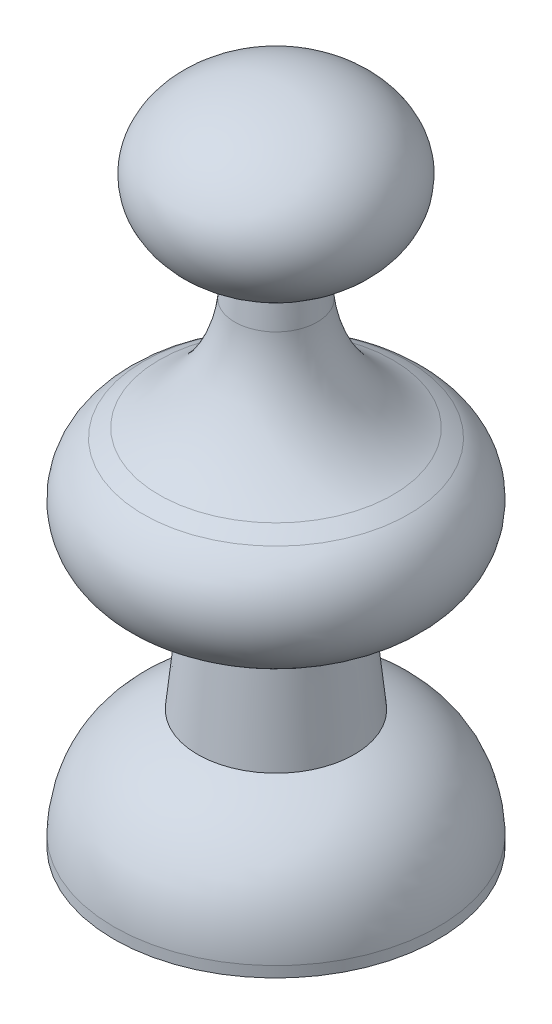
ISO-10303-21;
HEADER;
FILE_DESCRIPTION(('STEP AP214'),'2;1');
FILE_NAME('part.step','',(''),(''),'','','');
FILE_SCHEMA(('AUTOMOTIVE_DESIGN { 1 0 10303 214 1 1 1 1 }'));
ENDSEC;
DATA;
#1=APPLICATION_CONTEXT('core data for automotive mechanical design processes');
#2=APPLICATION_PROTOCOL_DEFINITION('international standard','automotive_design',2000,#1);
#3=PRODUCT_CONTEXT('',#1,'mechanical');
#4=PRODUCT('Part','Part','',(#3));
#5=PRODUCT_RELATED_PRODUCT_CATEGORY('part','',(#4));
#6=PRODUCT_DEFINITION_FORMATION('','',#4);
#7=PRODUCT_DEFINITION_CONTEXT('part definition',#1,'design');
#8=PRODUCT_DEFINITION('design','',#6,#7);
#9=PRODUCT_DEFINITION_SHAPE('','',#8);
#10=(LENGTH_UNIT() NAMED_UNIT(*) SI_UNIT(.MILLI.,.METRE.));
#11=(NAMED_UNIT(*) PLANE_ANGLE_UNIT() SI_UNIT($,.RADIAN.));
#12=(NAMED_UNIT(*) SI_UNIT($,.STERADIAN.) SOLID_ANGLE_UNIT());
#13=UNCERTAINTY_MEASURE_WITH_UNIT(LENGTH_MEASURE(1.E-05),#10,'distance_accuracy_value','');
#14=(GEOMETRIC_REPRESENTATION_CONTEXT(3) GLOBAL_UNCERTAINTY_ASSIGNED_CONTEXT((#13)) GLOBAL_UNIT_ASSIGNED_CONTEXT((#10,
#11,#12)) REPRESENTATION_CONTEXT('',''));
#15=CARTESIAN_POINT('',(0.,0.,0.));
#16=DIRECTION('',(0.,0.,1.));
#17=DIRECTION('',(1.,0.,0.));
#18=AXIS2_PLACEMENT_3D('',#15,#16,#17);
#19=CARTESIAN_POINT('',(0.,-0.762,0.));
#20=DIRECTION('',(0.,1.,0.));
#21=DIRECTION('',(0.,0.,1.));
#22=AXIS2_PLACEMENT_3D('',#19,#20,#21);
#23=CYLINDRICAL_SURFACE('',#22,11.5);
#24=CARTESIAN_POINT('',(0.,-0.762,0.));
#25=DIRECTION('',(0.,-1.,0.));
#26=DIRECTION('',(0.,0.,-1.));
#27=AXIS2_PLACEMENT_3D('',#24,#25,#26);
#28=CIRCLE('',#27,11.5);
#29=CARTESIAN_POINT('',(0.,-0.762,11.5));
#30=VERTEX_POINT('',#29);
#31=EDGE_CURVE('E11',#30,#30,#28,.T.);
#32=CARTESIAN_POINT('',(0.,0.,0.));
#33=DIRECTION('',(0.,-1.,0.));
#34=DIRECTION('',(0.,0.,-1.));
#35=AXIS2_PLACEMENT_3D('',#32,#33,#34);
#36=CIRCLE('',#35,11.5);
#37=CARTESIAN_POINT('',(0.,0.,11.5));
#38=VERTEX_POINT('',#37);
#39=EDGE_CURVE('E45',#38,#38,#36,.T.);
#40=CARTESIAN_POINT('',(0.,-0.762,11.5));
#41=CARTESIAN_POINT('',(0.,-0.7540625,11.5));
#42=CARTESIAN_POINT('',(0.,-0.746125,11.5));
#43=CARTESIAN_POINT('',(0.,-0.73025,11.5));
#44=CARTESIAN_POINT('',(0.,-0.7223125,11.5));
#45=CARTESIAN_POINT('',(0.,-0.7064375,11.5));
#46=CARTESIAN_POINT('',(0.,-0.6985,11.5));
#47=CARTESIAN_POINT('',(0.,-0.682625,11.5));
#48=CARTESIAN_POINT('',(0.,-0.6746875,11.5));
#49=CARTESIAN_POINT('',(0.,-0.6588125,11.5));
#50=CARTESIAN_POINT('',(0.,-0.650875,11.5));
#51=CARTESIAN_POINT('',(0.,-0.635,11.5));
#52=CARTESIAN_POINT('',(0.,-0.6270625,11.5));
#53=CARTESIAN_POINT('',(0.,-0.6111875,11.5));
#54=CARTESIAN_POINT('',(0.,-0.60325,11.5));
#55=CARTESIAN_POINT('',(0.,-0.587375,11.5));
#56=CARTESIAN_POINT('',(0.,-0.5794375,11.5));
#57=CARTESIAN_POINT('',(0.,-0.5635625,11.5));
#58=CARTESIAN_POINT('',(0.,-0.555625,11.5));
#59=CARTESIAN_POINT('',(0.,-0.53975,11.5));
#60=CARTESIAN_POINT('',(0.,-0.5318125,11.5));
#61=CARTESIAN_POINT('',(0.,-0.5159375,11.5));
#62=CARTESIAN_POINT('',(0.,-0.508,11.5));
#63=CARTESIAN_POINT('',(0.,-0.492125,11.5));
#64=CARTESIAN_POINT('',(0.,-0.4841875,11.5));
#65=CARTESIAN_POINT('',(0.,-0.4683125,11.5));
#66=CARTESIAN_POINT('',(0.,-0.460375,11.5));
#67=CARTESIAN_POINT('',(0.,-0.4445,11.5));
#68=CARTESIAN_POINT('',(0.,-0.4365625,11.5));
#69=CARTESIAN_POINT('',(0.,-0.4206875,11.5));
#70=CARTESIAN_POINT('',(0.,-0.41275,11.5));
#71=CARTESIAN_POINT('',(0.,-0.396875,11.5));
#72=CARTESIAN_POINT('',(0.,-0.3889375,11.5));
#73=CARTESIAN_POINT('',(0.,-0.3730625,11.5));
#74=CARTESIAN_POINT('',(0.,-0.365125,11.5));
#75=CARTESIAN_POINT('',(0.,-0.34925,11.5));
#76=CARTESIAN_POINT('',(0.,-0.3413125,11.5));
#77=CARTESIAN_POINT('',(0.,-0.3254375,11.5));
#78=CARTESIAN_POINT('',(0.,-0.3175,11.5));
#79=CARTESIAN_POINT('',(0.,-0.301625,11.5));
#80=CARTESIAN_POINT('',(0.,-0.2936875,11.5));
#81=CARTESIAN_POINT('',(0.,-0.2778125,11.5));
#82=CARTESIAN_POINT('',(0.,-0.269875,11.5));
#83=CARTESIAN_POINT('',(0.,-0.254,11.5));
#84=CARTESIAN_POINT('',(0.,-0.2460625,11.5));
#85=CARTESIAN_POINT('',(0.,-0.2301875,11.5));
#86=CARTESIAN_POINT('',(0.,-0.22225,11.5));
#87=CARTESIAN_POINT('',(0.,-0.206375,11.5));
#88=CARTESIAN_POINT('',(0.,-0.1984375,11.5));
#89=CARTESIAN_POINT('',(0.,-0.1825625,11.5));
#90=CARTESIAN_POINT('',(0.,-0.174625,11.5));
#91=CARTESIAN_POINT('',(0.,-0.15875,11.5));
#92=CARTESIAN_POINT('',(0.,-0.1508125,11.5));
#93=CARTESIAN_POINT('',(0.,-0.1349375,11.5));
#94=CARTESIAN_POINT('',(0.,-0.127,11.5));
#95=CARTESIAN_POINT('',(0.,-0.111125,11.5));
#96=CARTESIAN_POINT('',(0.,-0.1031875,11.5));
#97=CARTESIAN_POINT('',(0.,-0.0873125,11.5));
#98=CARTESIAN_POINT('',(0.,-0.079375,11.5));
#99=CARTESIAN_POINT('',(0.,-0.0635,11.5));
#100=CARTESIAN_POINT('',(0.,-0.0555625,11.5));
#101=CARTESIAN_POINT('',(0.,-0.0396875,11.5));
#102=CARTESIAN_POINT('',(0.,-0.03175,11.5));
#103=CARTESIAN_POINT('',(0.,-0.015875,11.5));
#104=CARTESIAN_POINT('',(0.,-0.00793749999999999,11.5));
#105=CARTESIAN_POINT('',(0.,0.,11.5));
#106=B_SPLINE_CURVE_WITH_KNOTS('',3,(#40,#41,#42,#43,#44,#45,#46,#47,#48,#49,#50,#51,#52,#53,
#54,#55,#56,#57,#58,#59,#60,#61,#62,#63,#64,#65,#66,#67,#68,#69,#70,#71,#72,#73,#74,#75,#76,#77,
#78,#79,#80,#81,#82,#83,#84,#85,#86,#87,#88,#89,#90,#91,#92,#93,#94,#95,#96,#97,#98,#99,#100,
#101,#102,#103,#104,#105),.UNSPECIFIED.,.F.,.F.,(4,2,2,2,2,2,2,2,2,2,2,2,2,2,2,2,2,2,2,2,2,2,2,
2,2,2,2,2,2,2,2,2,4),(0.,0.0238125000000001,0.047625,0.0714375,0.0952500000000001,0.1190625,
0.142875,0.1666875,0.1905,0.2143125,0.238125,0.2619375,0.28575,0.3095625,0.333375,0.3571875,
0.381,0.4048125,0.428625,0.4524375,0.47625,0.5000625,0.523875,0.5476875,0.5715,0.5953125,
0.619125,0.6429375,0.66675,0.6905625,0.714375,0.7381875,0.762),.UNSPECIFIED.);
#107=EDGE_CURVE('BSEAM42',#30,#38,#106,.T.);
#108=ORIENTED_EDGE('',*,*,#31,.F.);
#109=ORIENTED_EDGE('',*,*,#39,.T.);
#110=ORIENTED_EDGE('',*,*,#107,.T.);
#111=ORIENTED_EDGE('',*,*,#107,.F.);
#112=EDGE_LOOP('',(#108,#110,#109,#111));
#113=FACE_BOUND('',#112,.T.);
#114=ADVANCED_FACE('F42',(#113),#23,.T.);
#115=CARTESIAN_POINT('',(0.,-0.762,0.));
#116=DIRECTION('',(0.,-1.,0.));
#117=DIRECTION('',(0.,0.,-1.));
#118=AXIS2_PLACEMENT_3D('',#115,#116,#117);
#119=PLANE('',#118);
#120=ORIENTED_EDGE('',*,*,#31,.T.);
#121=EDGE_LOOP('',(#120));
#122=FACE_BOUND('',#121,.T.);
#123=ADVANCED_FACE('F57',(#122),#119,.T.);
#124=CARTESIAN_POINT('',(0.,0.,0.));
#125=DIRECTION('',(0.,-1.,0.));
#126=DIRECTION('',(0.,0.,-1.));
#127=AXIS2_PLACEMENT_3D('',#124,#125,#126);
#128=PLANE('',#127);
#129=ORIENTED_EDGE('',*,*,#39,.F.);
#130=EDGE_LOOP('',(#129));
#131=FACE_BOUND('',#130,.T.);
#132=ADVANCED_FACE('F55',(#131),#128,.F.);
#133=CLOSED_SHELL('',(#114,#123,#132));
#134=MANIFOLD_SOLID_BREP('B2',#133);
#135=CARTESIAN_POINT('',(0.,40.48125,0.));
#136=DIRECTION('',(0.,0.,1.));
#137=DIRECTION('',(-1.,0.,0.));
#138=AXIS2_PLACEMENT_3D('',#135,#136,#137);
#139=ELLIPSE('',#138,7.9375,5.55625);
#140=TRIMMED_CURVE('',#139,(PARAMETER_VALUE(4.71238898038469)),
(PARAMETER_VALUE(7.85398163397448)),.T.,.PARAMETER.);
#141=CARTESIAN_POINT('',(0.,46.0375,0.));
#142=DIRECTION('',(0.,1.,0.));
#143=AXIS1_PLACEMENT('',#141,#142);
#144=SURFACE_OF_REVOLUTION('',#140,#143);
#145=CARTESIAN_POINT('',(0.,35.2509756556801,0.));
#146=DIRECTION('',(0.,1.,0.));
#147=DIRECTION('',(0.,0.,1.));
#148=AXIS2_PLACEMENT_3D('',#145,#146,#147);
#149=CIRCLE('',#148,2.67876926722676);
#150=CARTESIAN_POINT('',(0.,35.2509756556801,2.67876926722676));
#151=VERTEX_POINT('',#150);
#152=EDGE_CURVE('E147',#151,#151,#149,.T.);
#153=ORIENTED_EDGE('',*,*,#152,.T.);
#154=EDGE_LOOP('',(#153));
#155=FACE_BOUND('',#154,.T.);
#156=CARTESIAN_POINT('',(0.,46.0375,0.));
#157=VERTEX_POINT('',#156);
#158=VERTEX_LOOP('',#157);
#159=FACE_BOUND('',#158,.T.);
#160=ADVANCED_FACE('F82',(#155,#159),#144,.F.);
#161=CARTESIAN_POINT('',(0.,35.2509756556801,0.));
#162=DIRECTION('',(0.,-1.,0.));
#163=DIRECTION('',(0.,0.,-1.));
#164=AXIS2_PLACEMENT_3D('',#161,#162,#163);
#165=CONICAL_SURFACE('',#164,2.67876926722676,0.103755465981785);
#166=CARTESIAN_POINT('',(0.,32.8711629756407,0.));
#167=DIRECTION('',(0.,-1.,0.));
#168=DIRECTION('',(0.,0.,-1.));
#169=AXIS2_PLACEMENT_3D('',#166,#167,#168);
#170=CIRCLE('',#169,2.92657771519886);
#171=CARTESIAN_POINT('',(0.,32.8711629756407,-2.92657771519886));
#172=VERTEX_POINT('',#171);
#173=EDGE_CURVE('E89',#172,#172,#170,.F.);
#174=ORIENTED_EDGE('',*,*,#173,.T.);
#175=EDGE_LOOP('',(#174));
#176=FACE_BOUND('',#175,.T.);
#177=ORIENTED_EDGE('',*,*,#152,.F.);
#178=EDGE_LOOP('',(#177));
#179=FACE_BOUND('',#178,.T.);
#180=ADVANCED_FACE('F93',(#176,#179),#165,.T.);
#181=CARTESIAN_POINT('',(0.,9.19742677821334,0.));
#182=DIRECTION('',(0.,1.,0.));
#183=DIRECTION('',(-1.,0.,0.));
#184=AXIS2_PLACEMENT_3D('',#181,#182,#183);
#185=SPHERICAL_SURFACE('',#184,17.7900732217866);
#186=CARTESIAN_POINT('',(0.,24.9353953916867,0.));
#187=DIRECTION('',(0.,-1.,0.));
#188=DIRECTION('',(0.,0.,-1.));
#189=AXIS2_PLACEMENT_3D('',#186,#187,#188);
#190=CIRCLE('',#189,8.29476034360598);
#191=CARTESIAN_POINT('',(-8.29476034360598,24.9353953916867,0.));
#192=VERTEX_POINT('',#191);
#193=EDGE_CURVE('E40',#192,#192,#190,.T.);
#194=CARTESIAN_POINT('',(0.,24.2949830228534,0.));
#195=DIRECTION('',(0.,1.,0.));
#196=DIRECTION('',(0.,0.,1.));
#197=AXIS2_PLACEMENT_3D('',#194,#195,#196);
#198=CIRCLE('',#197,9.41012755898983);
#199=CARTESIAN_POINT('',(-9.41012755898981,24.2949830228534,0.));
#200=VERTEX_POINT('',#199);
#201=EDGE_CURVE('E145',#200,#200,#198,.T.);
#202=CARTESIAN_POINT('',(-8.29476034360598,24.9353953916867,0.));
#203=CARTESIAN_POINT('',(-8.30661488255896,24.9291474087659,0.));
#204=CARTESIAN_POINT('',(-8.31846236209785,24.9228860317468,0.));
#205=CARTESIAN_POINT('',(-8.34214314190666,24.9103365215928,0.));
#206=CARTESIAN_POINT('',(-8.35397644217658,24.9040483884579,0.));
#207=CARTESIAN_POINT('',(-8.37762880300666,24.8914453981532,0.));
#208=CARTESIAN_POINT('',(-8.38944786356682,24.8851305409833,0.));
#209=CARTESIAN_POINT('',(-8.41307168462869,24.8724741348625,0.));
#210=CARTESIAN_POINT('',(-8.42487644513041,24.8661325859116,0.));
#211=CARTESIAN_POINT('',(-8.44847160579455,24.8534228286089,0.));
#212=CARTESIAN_POINT('',(-8.46026200595697,24.8470546202573,0.));
#213=CARTESIAN_POINT('',(-8.48382838573638,24.8342915766724,0.));
#214=CARTESIAN_POINT('',(-8.49560436535337,24.8278967414391,0.));
#215=CARTESIAN_POINT('',(-8.51914184390906,24.8150804767454,0.));
#216=CARTESIAN_POINT('',(-8.53090334284775,24.808659047285,0.));
#217=CARTESIAN_POINT('',(-8.55441179998802,24.7957896269273,0.));
#218=CARTESIAN_POINT('',(-8.56615875818959,24.7893416360301,0.));
#219=CARTESIAN_POINT('',(-8.58963807387101,24.7764191257248,0.));
#220=CARTESIAN_POINT('',(-8.60137043135086,24.7699446063167,0.));
#221=CARTESIAN_POINT('',(-8.62482048567879,24.7569690720512,0.));
#222=CARTESIAN_POINT('',(-8.63653818252688,24.7504680571938,0.));
#223=CARTESIAN_POINT('',(-8.65995885575611,24.7374395652263,0.));
#224=CARTESIAN_POINT('',(-8.67166183213726,24.7309120881162,0.));
#225=CARTESIAN_POINT('',(-8.69505300467262,24.7178307049753,0.));
#226=CARTESIAN_POINT('',(-8.70674120082683,24.7112767989445,0.));
#227=CARTESIAN_POINT('',(-8.73010275322376,24.6981425914288,0.));
#228=CARTESIAN_POINT('',(-8.74177610946649,24.6915622899441,0.));
#229=CARTESIAN_POINT('',(-8.76510792243173,24.6783753251222,0.));
#230=CARTESIAN_POINT('',(-8.77676637915423,24.6717686617851,0.));
#231=CARTESIAN_POINT('',(-8.80006833354632,24.6585290069948,0.));
#232=CARTESIAN_POINT('',(-8.81171183121592,24.6518960155415,0.));
#233=CARTESIAN_POINT('',(-8.83498380804592,24.6386037383897,0.));
#234=CARTESIAN_POINT('',(-8.84661228720633,24.631944452691,0.));
#235=CARTESIAN_POINT('',(-8.86985416763836,24.6185996210532,0.));
#236=CARTESIAN_POINT('',(-8.88146756890999,24.6119140751141,0.));
#237=CARTESIAN_POINT('',(-8.90467923426185,24.5985167571343,0.));
#238=CARTESIAN_POINT('',(-8.91627749834209,24.5918049850937,0.));
#239=CARTESIAN_POINT('',(-8.93945883008589,24.5783552491839,0.));
#240=CARTESIAN_POINT('',(-8.95104189774944,24.5716172853148,0.));
#241=CARTESIAN_POINT('',(-8.97419277751215,24.5581152001547,0.));
#242=CARTESIAN_POINT('',(-8.98576058961131,24.5513510788637,0.));
#243=CARTESIAN_POINT('',(-9.00888089917543,24.5377967134003,0.));
#244=CARTESIAN_POINT('',(-9.02043339664039,24.5310064692277,0.));
#245=CARTESIAN_POINT('',(-9.0435230179445,24.5173998926748,0.));
#246=CARTESIAN_POINT('',(-9.05506014178366,24.5105835602944,0.));
#247=CARTESIAN_POINT('',(-9.07811895692307,24.4969248421326,0.));
#248=CARTESIAN_POINT('',(-9.08964064822333,24.4900824563511,0.));
#249=CARTESIAN_POINT('',(-9.11266853945065,24.4763716663272,0.));
#250=CARTESIAN_POINT('',(-9.12417473937772,24.4695032620847,0.));
#251=CARTESIAN_POINT('',(-9.14717158910346,24.4557404702113,0.));
#252=CARTESIAN_POINT('',(-9.15866223890214,24.4488460825805,0.));
#253=CARTESIAN_POINT('',(-9.18162792969535,24.4350313591359,0.));
#254=CARTESIAN_POINT('',(-9.19310297068986,24.4281110233222,0.));
#255=CARTESIAN_POINT('',(-9.21603738527864,24.4142444388499,0.));
#256=CARTESIAN_POINT('',(-9.22749675887289,24.4072981901913,0.));
#257=CARTESIAN_POINT('',(-9.25039978014515,24.3933798154995,0.));
#258=CARTESIAN_POINT('',(-9.26184342782316,24.3864076894664,0.));
#259=CARTESIAN_POINT('',(-9.28471493882682,24.3724375956275,0.));
#260=CARTESIAN_POINT('',(-9.29614280215247,24.3654396278217,0.));
#261=CARTESIAN_POINT('',(-9.31898268609748,24.3514178861739,0.));
#262=CARTESIAN_POINT('',(-9.33039470671685,24.3443941123319,0.));
#263=CARTESIAN_POINT('',(-9.3532028469704,24.3303207944704,0.));
#264=CARTESIAN_POINT('',(-9.36459896660458,24.3232712504508,0.));
#265=CARTESIAN_POINT('',(-9.38737524671193,24.3091464282598,0.));
#266=CARTESIAN_POINT('',(-9.39875540718509,24.3020711500882,0.));
#267=CARTESIAN_POINT('',(-9.41012755898981,24.2949830228534,0.));
#268=B_SPLINE_CURVE_WITH_KNOTS('',3,(#202,#203,#204,#205,#206,#207,#208,#209,#210,#211,#212,
#213,#214,#215,#216,#217,#218,#219,#220,#221,#222,#223,#224,#225,#226,#227,#228,#229,#230,#231,
#232,#233,#234,#235,#236,#237,#238,#239,#240,#241,#242,#243,#244,#245,#246,#247,#248,#249,#250,
#251,#252,#253,#254,#255,#256,#257,#258,#259,#260,#261,#262,#263,#264,#265,#266,#267),
.UNSPECIFIED.,.F.,.F.,(4,2,2,2,2,2,2,2,2,2,2,2,2,2,2,2,2,2,2,2,2,2,2,2,2,2,2,2,2,2,2,2,4),(0.,
0.0402008180460877,0.080401636092175,0.120602454138267,0.160803272184354,0.201004090230441,
0.24120490827653,0.281405726322616,0.321606544368708,0.361807362414796,0.402008180460884,
0.442208998506972,0.482409816553059,0.522610634599145,0.562811452645236,0.603012270691325,
0.643213088737413,0.6834139067835,0.723614724829587,0.76381554287568,0.804016360921766,
0.844217178967853,0.884417997013942,0.92461881506003,0.964819633106116,1.00502045115221,
1.0452212691983,1.08542208724438,1.12562290529047,1.16582372333656,1.20602454138265,
1.24622535942874,1.28642617747483),.UNSPECIFIED.);
#269=EDGE_CURVE('BSEAM98',#192,#200,#268,.T.);
#270=ORIENTED_EDGE('',*,*,#193,.T.);
#271=ORIENTED_EDGE('',*,*,#201,.T.);
#272=ORIENTED_EDGE('',*,*,#269,.T.);
#273=ORIENTED_EDGE('',*,*,#269,.F.);
#274=EDGE_LOOP('',(#270,#272,#271,#273));
#275=FACE_BOUND('',#274,.T.);
#276=ADVANCED_FACE('F98',(#275),#185,.T.);
#277=CARTESIAN_POINT('',(0.,20.5298074487026,0.));
#278=DIRECTION('',(0.,1.,0.));
#279=DIRECTION('',(0.,0.,1.));
#280=AXIS2_PLACEMENT_3D('',#277,#278,#279);
#281=TOROIDAL_SURFACE('',#280,7.0633383263065,4.43666167369348);
#282=CARTESIAN_POINT('',(0.,16.3990213109782,0.));
#283=DIRECTION('',(0.,1.,0.));
#284=DIRECTION('',(0.,0.,1.));
#285=AXIS2_PLACEMENT_3D('',#282,#283,#284);
#286=CIRCLE('',#285,8.68215662716833);
#287=CARTESIAN_POINT('',(-8.68215662716833,16.3990213109782,0.));
#288=VERTEX_POINT('',#287);
#289=EDGE_CURVE('E148',#288,#288,#286,.T.);
#290=ORIENTED_EDGE('',*,*,#289,.T.);
#291=EDGE_LOOP('',(#290));
#292=FACE_BOUND('',#291,.T.);
#293=ORIENTED_EDGE('',*,*,#201,.F.);
#294=EDGE_LOOP('',(#293));
#295=FACE_BOUND('',#294,.T.);
#296=ADVANCED_FACE('F133',(#292,#295),#281,.T.);
#297=CARTESIAN_POINT('',(0.,38.5535350213588,0.));
#298=DIRECTION('',(0.,1.,0.));
#299=DIRECTION('',(-1.,0.,0.));
#300=AXIS2_PLACEMENT_3D('',#297,#298,#299);
#301=SPHERICAL_SURFACE('',#300,23.7950062290835);
#302=CARTESIAN_POINT('',(0.,15.5355633437393,0.));
#303=DIRECTION('',(0.,1.,0.));
#304=DIRECTION('',(0.,0.,1.));
#305=AXIS2_PLACEMENT_3D('',#302,#303,#304);
#306=CIRCLE('',#305,6.03119401863606);
#307=CARTESIAN_POINT('',(-6.03119401863603,15.5355633437393,0.));
#308=VERTEX_POINT('',#307);
#309=EDGE_CURVE('E152',#308,#308,#306,.T.);
#310=CARTESIAN_POINT('',(-6.03119401863603,15.5355633437393,0.));
#311=CARTESIAN_POINT('',(-6.05930380907633,15.5429287013928,0.));
#312=CARTESIAN_POINT('',(-6.08740010740792,15.5503455514932,0.));
#313=CARTESIAN_POINT('',(-6.14356534302965,15.5652821359482,0.));
#314=CARTESIAN_POINT('',(-6.1716342803198,15.5728018703029,0.));
#315=CARTESIAN_POINT('',(-6.22774441703466,15.5879441226272,0.));
#316=CARTESIAN_POINT('',(-6.25578561645937,15.5955666405967,0.));
#317=CARTESIAN_POINT('',(-6.31183990109005,15.6109143577618,0.));
#318=CARTESIAN_POINT('',(-6.33985298629602,15.6186395569573,0.));
#319=CARTESIAN_POINT('',(-6.39585066648692,15.634192532906,0.));
#320=CARTESIAN_POINT('',(-6.42383526147184,15.6420203096593,0.));
#321=CARTESIAN_POINT('',(-6.4797755856078,15.6577783356522,0.));
#322=CARTESIAN_POINT('',(-6.50773131475883,15.6657085848918,0.));
#323=CARTESIAN_POINT('',(-6.56361353199972,15.6816714494176,0.));
#324=CARTESIAN_POINT('',(-6.59154002008956,15.6897040647038,0.));
#325=CARTESIAN_POINT('',(-6.64736338037377,15.7058715535072,0.));
#326=CARTESIAN_POINT('',(-6.67526025256812,15.7140064270244,0.));
#327=CARTESIAN_POINT('',(-6.7310240066244,15.7303783231021,0.));
#328=CARTESIAN_POINT('',(-6.75889088848633,15.7386153456626,0.));
#329=CARTESIAN_POINT('',(-6.81459428784339,15.755191429268,0.));
#330=CARTESIAN_POINT('',(-6.84243080533853,15.763530490313,0.));
#331=CARTESIAN_POINT('',(-6.8980731023352,15.780310538959,0.));
#332=CARTESIAN_POINT('',(-6.92587888183673,15.78875152656,0.));
#333=CARTESIAN_POINT('',(-6.98145932963194,15.8057353150217,0.));
#334=CARTESIAN_POINT('',(-7.00923399792562,15.8142781158823,0.));
#335=CARTESIAN_POINT('',(-7.06475185050847,15.8314654162002,0.));
#336=CARTESIAN_POINT('',(-7.09249503479764,15.8401099156574,0.));
#337=CARTESIAN_POINT('',(-7.14794954699739,15.8575004971404,0.));
#338=CARTESIAN_POINT('',(-7.17566087490797,15.8662465791661,0.));
#339=CARTESIAN_POINT('',(-7.23105130240404,15.8838402083946,0.));
#340=CARTESIAN_POINT('',(-7.25873040198954,15.8926877555974,0.));
#341=CARTESIAN_POINT('',(-7.31405600132152,15.9104841964265,0.));
#342=CARTESIAN_POINT('',(-7.341702501068,15.9194330900529,0.));
#343=CARTESIAN_POINT('',(-7.3969625296456,15.9374321036156,0.));
#344=CARTESIAN_POINT('',(-7.42457605847672,15.9464822235519,0.));
#345=CARTESIAN_POINT('',(-7.47976977458976,15.9646835682621,0.));
#346=CARTESIAN_POINT('',(-7.50734996187169,15.973834793036,0.));
#347=CARTESIAN_POINT('',(-7.56247662470005,15.992238224592,0.));
#348=CARTESIAN_POINT('',(-7.59002310024648,16.0014904313741,0.));
#349=CARTESIAN_POINT('',(-7.64508196987004,16.0200957027616,0.));
#350=CARTESIAN_POINT('',(-7.67259436394717,16.029448767367,0.));
#351=CARTESIAN_POINT('',(-7.72758470135574,16.0482556288627,0.));
#352=CARTESIAN_POINT('',(-7.75506264468719,16.057709425753,0.));
#353=CARTESIAN_POINT('',(-7.80998371179043,16.0767176249278,0.));
#354=CARTESIAN_POINT('',(-7.83742683556223,16.0862720272123,0.));
#355=CARTESIAN_POINT('',(-7.89227789519957,16.1054813089347,0.));
#356=CARTESIAN_POINT('',(-7.91968583106511,16.1151361883725,0.));
#357=CARTESIAN_POINT('',(-7.97446614701562,16.1345462948119,0.));
#358=CARTESIAN_POINT('',(-8.0018385271006,16.1443015218135,0.));
#359=CARTESIAN_POINT('',(-8.05654736409289,16.163912192444,0.));
#360=CARTESIAN_POINT('',(-8.0838838210002,16.1737676360729,0.));
#361=CARTESIAN_POINT('',(-8.13852044472231,16.1935786076765,0.));
#362=CARTESIAN_POINT('',(-8.1658206115371,16.2035341356511,0.));
#363=CARTESIAN_POINT('',(-8.22038428864619,16.2235451423215,0.));
#364=CARTESIAN_POINT('',(-8.24764779894049,16.2336006210172,0.));
#365=CARTESIAN_POINT('',(-8.30213779707335,16.253811394162,0.));
#366=CARTESIAN_POINT('',(-8.32936428491191,16.263966688611,0.));
#367=CARTESIAN_POINT('',(-8.3837798726923,16.2843769569615,0.));
#368=CARTESIAN_POINT('',(-8.41096897263414,16.2946319308629,0.));
#369=CARTESIAN_POINT('',(-8.46530941969188,16.3152414204539,0.));
#370=CARTESIAN_POINT('',(-8.49246076680777,16.3255959361435,0.));
#371=CARTESIAN_POINT('',(-8.54672534375404,16.3464043704059,0.));
#372=CARTESIAN_POINT('',(-8.57383857358442,16.3568582889788,0.));
#373=CARTESIAN_POINT('',(-8.62802655215008,16.377865388412,0.));
#374=CARTESIAN_POINT('',(-8.65510130088537,16.3884185692722,0.));
#375=CARTESIAN_POINT('',(-8.68215662716833,16.3990213109782,0.));
#376=B_SPLINE_CURVE_WITH_KNOTS('',3,(#310,#311,#312,#313,#314,#315,#316,#317,#318,#319,#320,
#321,#322,#323,#324,#325,#326,#327,#328,#329,#330,#331,#332,#333,#334,#335,#336,#337,#338,#339,
#340,#341,#342,#343,#344,#345,#346,#347,#348,#349,#350,#351,#352,#353,#354,#355,#356,#357,#358,
#359,#360,#361,#362,#363,#364,#365,#366,#367,#368,#369,#370,#371,#372,#373,#374,#375),
.UNSPECIFIED.,.F.,.F.,(4,2,2,2,2,2,2,2,2,2,2,2,2,2,2,2,2,2,2,2,2,2,2,2,2,2,2,2,2,2,2,2,4),(0.,
0.0871760907979623,0.174352181595923,0.261528272393886,0.348704363191848,0.435880453989809,
0.523056544787772,0.610232635585733,0.697408726383696,0.784584817181658,0.871760907979619,
0.95893699877758,1.04611308957554,1.1332891803735,1.22046527117147,1.30764136196943,
1.39481745276739,1.48199354356535,1.56916963436331,1.65634572516127,1.74352181595924,
1.8306979067572,1.91787399755516,2.00505008835312,2.09222617915109,2.17940226994905,
2.26657836074701,2.35375445154497,2.44093054234293,2.52810663314089,2.61528272393886,
2.70245881473682,2.78963490553478),.UNSPECIFIED.);
#377=EDGE_CURVE('BSEAM129',#308,#288,#376,.T.);
#378=ORIENTED_EDGE('',*,*,#309,.T.);
#379=ORIENTED_EDGE('',*,*,#289,.F.);
#380=ORIENTED_EDGE('',*,*,#377,.T.);
#381=ORIENTED_EDGE('',*,*,#377,.F.);
#382=EDGE_LOOP('',(#378,#380,#379,#381));
#383=FACE_BOUND('',#382,.T.);
#384=ADVANCED_FACE('F129',(#383),#301,.T.);
#385=CARTESIAN_POINT('',(0.,14.0613301160205,0.));
#386=DIRECTION('',(0.,1.,0.));
#387=DIRECTION('',(0.,0.,1.));
#388=AXIS2_PLACEMENT_3D('',#385,#386,#387);
#389=TOROIDAL_SURFACE('',#388,6.41747421524164,1.524);
#390=CARTESIAN_POINT('',(0.,13.903490337989,0.));
#391=DIRECTION('',(0.,1.,0.));
#392=DIRECTION('',(0.,0.,1.));
#393=AXIS2_PLACEMENT_3D('',#390,#391,#392);
#394=CIRCLE('',#393,4.90166993880257);
#395=CARTESIAN_POINT('',(0.,13.903490337989,4.90166993880257));
#396=VERTEX_POINT('',#395);
#397=EDGE_CURVE('E171',#396,#396,#394,.T.);
#398=ORIENTED_EDGE('',*,*,#397,.T.);
#399=EDGE_LOOP('',(#398));
#400=FACE_BOUND('',#399,.T.);
#401=ORIENTED_EDGE('',*,*,#309,.F.);
#402=EDGE_LOOP('',(#401));
#403=FACE_BOUND('',#402,.T.);
#404=ADVANCED_FACE('F125',(#400,#403),#389,.F.);
#405=CARTESIAN_POINT('',(0.,13.903490337989,0.));
#406=DIRECTION('',(0.,-1.,0.));
#407=DIRECTION('',(0.,0.,-1.));
#408=AXIS2_PLACEMENT_3D('',#405,#406,#407);
#409=CONICAL_SURFACE('',#408,4.90166993880257,0.103755465981784);
#410=CARTESIAN_POINT('',(0.,7.61727232368625,0.));
#411=DIRECTION('',(0.,1.,0.));
#412=DIRECTION('',(0.,0.,1.));
#413=AXIS2_PLACEMENT_3D('',#410,#411,#412);
#414=CIRCLE('',#413,5.55625);
#415=CARTESIAN_POINT('',(0.,7.61727232368625,5.55625));
#416=VERTEX_POINT('',#415);
#417=EDGE_CURVE('E169',#416,#416,#414,.T.);
#418=ORIENTED_EDGE('',*,*,#417,.T.);
#419=EDGE_LOOP('',(#418));
#420=FACE_BOUND('',#419,.T.);
#421=ORIENTED_EDGE('',*,*,#397,.F.);
#422=EDGE_LOOP('',(#421));
#423=FACE_BOUND('',#422,.T.);
#424=ADVANCED_FACE('F121',(#420,#423),#409,.T.);
#425=CARTESIAN_POINT('',(-5.55625,7.61727232368625,0.));
#426=CARTESIAN_POINT('',(-11.2207392934526,5.54480325649878,0.));
#427=CARTESIAN_POINT('',(-11.5,0.,0.));
#428=B_SPLINE_CURVE_WITH_KNOTS('',2,(#425,#426,#427),.UNSPECIFIED.,.F.,.F.,(3,3),(0.,1.),.UNSPECIFIED.);
#429=CARTESIAN_POINT('',(0.,46.0375,0.));
#430=DIRECTION('',(0.,1.,0.));
#431=AXIS1_PLACEMENT('',#429,#430);
#432=SURFACE_OF_REVOLUTION('',#428,#431);
#433=CARTESIAN_POINT('',(0.,0.,0.));
#434=DIRECTION('',(0.,1.,0.));
#435=DIRECTION('',(0.,0.,1.));
#436=AXIS2_PLACEMENT_3D('',#433,#434,#435);
#437=CIRCLE('',#436,11.5);
#438=CARTESIAN_POINT('',(0.,0.,11.5));
#439=VERTEX_POINT('',#438);
#440=EDGE_CURVE('E110',#439,#439,#437,.T.);
#441=ORIENTED_EDGE('',*,*,#440,.T.);
#442=EDGE_LOOP('',(#441));
#443=FACE_BOUND('',#442,.T.);
#444=ORIENTED_EDGE('',*,*,#417,.F.);
#445=EDGE_LOOP('',(#444));
#446=FACE_BOUND('',#445,.T.);
#447=ADVANCED_FACE('F116',(#443,#446),#432,.F.);
#448=CARTESIAN_POINT('',(0.,0.,0.));
#449=DIRECTION('',(0.,-1.,0.));
#450=DIRECTION('',(0.,0.,-1.));
#451=AXIS2_PLACEMENT_3D('',#448,#449,#450);
#452=PLANE('',#451);
#453=ORIENTED_EDGE('',*,*,#440,.F.);
#454=EDGE_LOOP('',(#453));
#455=FACE_BOUND('',#454,.T.);
#456=ADVANCED_FACE('F120',(#455),#452,.T.);
#457=CARTESIAN_POINT('',(0.,33.923428162517,0.));
#458=DIRECTION('',(0.,-1.,0.));
#459=DIRECTION('',(0.,0.,-1.));
#460=AXIS2_PLACEMENT_3D('',#457,#458,#459);
#461=TOROIDAL_SURFACE('',#460,13.031939558126,10.16);
#462=ORIENTED_EDGE('',*,*,#193,.F.);
#463=EDGE_LOOP('',(#462));
#464=FACE_BOUND('',#463,.T.);
#465=ORIENTED_EDGE('',*,*,#173,.F.);
#466=EDGE_LOOP('',(#465));
#467=FACE_BOUND('',#466,.T.);
#468=ADVANCED_FACE('F84',(#464,#467),#461,.F.);
#469=CLOSED_SHELL('',(#160,#180,#276,#296,#384,#404,#424,#447,#456,#468));
#470=MANIFOLD_SOLID_BREP('B6',#469);
#471=ADVANCED_BREP_SHAPE_REPRESENTATION('',(#18,#134,#470),#14);
#472=SHAPE_DEFINITION_REPRESENTATION(#9,#471);
ENDSEC;
END-ISO-10303-21;
